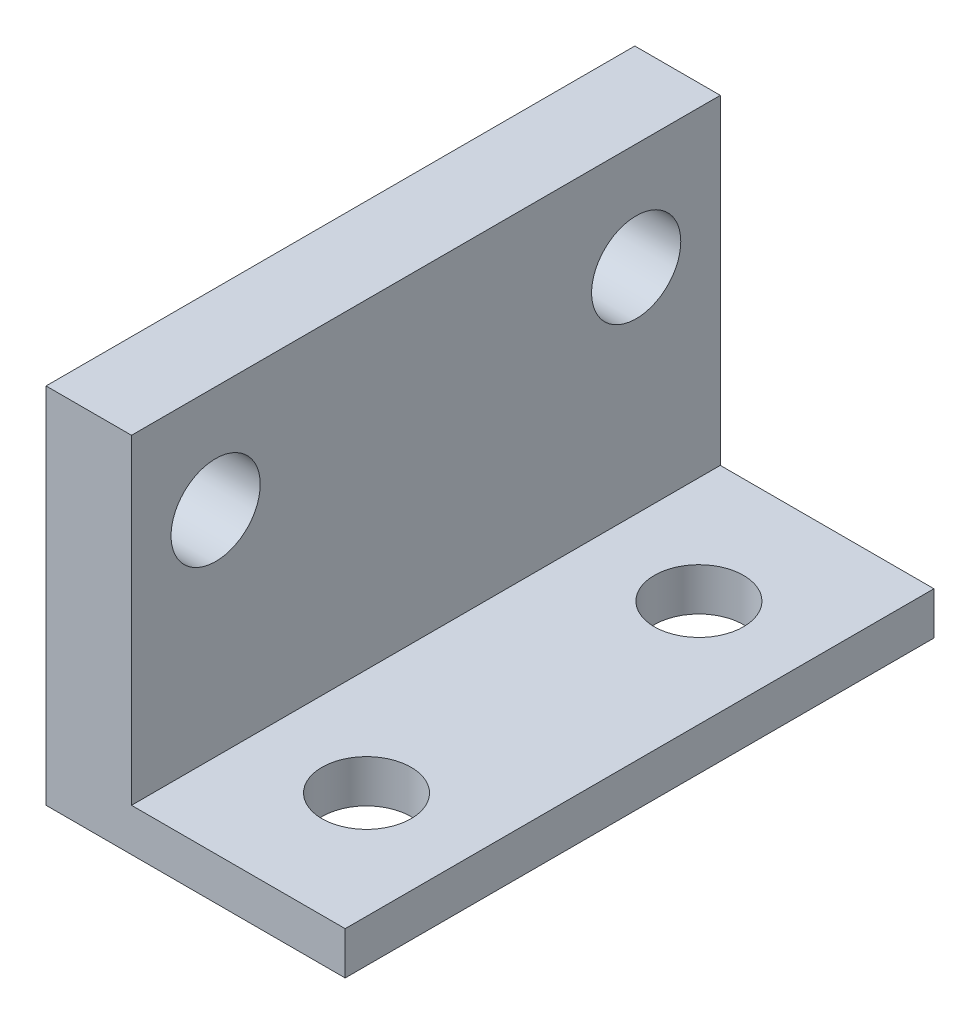
ISO-10303-21;
HEADER;
FILE_DESCRIPTION(('STEP AP214'),'2;1');
FILE_NAME('part.step','',(''),(''),'','','');
FILE_SCHEMA(('AUTOMOTIVE_DESIGN { 1 0 10303 214 1 1 1 1 }'));
ENDSEC;
DATA;
#1=APPLICATION_CONTEXT('core data for automotive mechanical design processes');
#2=APPLICATION_PROTOCOL_DEFINITION('international standard','automotive_design',2000,#1);
#3=PRODUCT_CONTEXT('',#1,'mechanical');
#4=PRODUCT('Part','Part','',(#3));
#5=PRODUCT_RELATED_PRODUCT_CATEGORY('part','',(#4));
#6=PRODUCT_DEFINITION_FORMATION('','',#4);
#7=PRODUCT_DEFINITION_CONTEXT('part definition',#1,'design');
#8=PRODUCT_DEFINITION('design','',#6,#7);
#9=PRODUCT_DEFINITION_SHAPE('','',#8);
#10=(LENGTH_UNIT() NAMED_UNIT(*) SI_UNIT(.MILLI.,.METRE.));
#11=(NAMED_UNIT(*) PLANE_ANGLE_UNIT() SI_UNIT($,.RADIAN.));
#12=(NAMED_UNIT(*) SI_UNIT($,.STERADIAN.) SOLID_ANGLE_UNIT());
#13=UNCERTAINTY_MEASURE_WITH_UNIT(LENGTH_MEASURE(1.E-05),#10,'distance_accuracy_value','');
#14=(GEOMETRIC_REPRESENTATION_CONTEXT(3) GLOBAL_UNCERTAINTY_ASSIGNED_CONTEXT((#13)) GLOBAL_UNIT_ASSIGNED_CONTEXT((#10,
#11,#12)) REPRESENTATION_CONTEXT('',''));
#15=CARTESIAN_POINT('',(0.,0.,0.));
#16=DIRECTION('',(0.,0.,1.));
#17=DIRECTION('',(1.,0.,0.));
#18=AXIS2_PLACEMENT_3D('',#15,#16,#17);
#19=CARTESIAN_POINT('',(0.,0.,35.));
#20=DIRECTION('',(0.,0.,1.));
#21=DIRECTION('',(1.,0.,0.));
#22=AXIS2_PLACEMENT_3D('',#19,#20,#21);
#23=PLANE('',#22);
#24=DIRECTION('',(1.,0.,0.));
#25=VECTOR('',#24,1.);
#26=CARTESIAN_POINT('',(0.,21.59,35.));
#27=LINE('',#26,#25);
#28=CARTESIAN_POINT('',(0.,21.59,35.));
#29=VERTEX_POINT('',#28);
#30=CARTESIAN_POINT('',(5.08,21.59,35.));
#31=VERTEX_POINT('',#30);
#32=EDGE_CURVE('E95',#29,#31,#27,.T.);
#33=ORIENTED_EDGE('',*,*,#32,.F.);
#34=DIRECTION('',(0.,1.,0.));
#35=VECTOR('',#34,1.);
#36=CARTESIAN_POINT('',(0.,2.54,35.));
#37=LINE('',#36,#35);
#38=CARTESIAN_POINT('',(0.,0.,35.));
#39=VERTEX_POINT('',#38);
#40=EDGE_CURVE('E140',#39,#29,#37,.T.);
#41=ORIENTED_EDGE('',*,*,#40,.F.);
#42=DIRECTION('',(1.,0.,0.));
#43=VECTOR('',#42,1.);
#44=CARTESIAN_POINT('',(0.,0.,35.));
#45=LINE('',#44,#43);
#46=CARTESIAN_POINT('',(17.78,0.,35.));
#47=VERTEX_POINT('',#46);
#48=EDGE_CURVE('E99',#39,#47,#45,.T.);
#49=ORIENTED_EDGE('',*,*,#48,.T.);
#50=DIRECTION('',(0.,1.,0.));
#51=VECTOR('',#50,1.);
#52=CARTESIAN_POINT('',(17.78,0.,35.));
#53=LINE('',#52,#51);
#54=CARTESIAN_POINT('',(17.78,2.54,35.));
#55=VERTEX_POINT('',#54);
#56=EDGE_CURVE('E109',#47,#55,#53,.T.);
#57=ORIENTED_EDGE('',*,*,#56,.T.);
#58=DIRECTION('',(1.,0.,0.));
#59=VECTOR('',#58,1.);
#60=CARTESIAN_POINT('',(0.,2.54,35.));
#61=LINE('',#60,#59);
#62=CARTESIAN_POINT('',(5.08,2.54,35.));
#63=VERTEX_POINT('',#62);
#64=EDGE_CURVE('E107',#63,#55,#61,.T.);
#65=ORIENTED_EDGE('',*,*,#64,.F.);
#66=DIRECTION('',(0.,1.,0.));
#67=VECTOR('',#66,1.);
#68=CARTESIAN_POINT('',(5.08,2.54,35.));
#69=LINE('',#68,#67);
#70=EDGE_CURVE('E137',#63,#31,#69,.T.);
#71=ORIENTED_EDGE('',*,*,#70,.T.);
#72=EDGE_LOOP('',(#33,#41,#49,#57,#65,#71));
#73=FACE_BOUND('',#72,.T.);
#74=ADVANCED_FACE('F33',(#73),#23,.T.);
#75=CARTESIAN_POINT('',(0.,21.59,35.));
#76=DIRECTION('',(0.,1.,0.));
#77=DIRECTION('',(0.,0.,1.));
#78=AXIS2_PLACEMENT_3D('',#75,#76,#77);
#79=PLANE('',#78);
#80=DIRECTION('',(1.,0.,0.));
#81=VECTOR('',#80,1.);
#82=CARTESIAN_POINT('',(0.,21.59,0.));
#83=LINE('',#82,#81);
#84=CARTESIAN_POINT('',(0.,21.59,0.));
#85=VERTEX_POINT('',#84);
#86=CARTESIAN_POINT('',(5.08,21.59,0.));
#87=VERTEX_POINT('',#86);
#88=EDGE_CURVE('E100',#85,#87,#83,.T.);
#89=ORIENTED_EDGE('',*,*,#88,.F.);
#90=DIRECTION('',(0.,0.,-1.));
#91=VECTOR('',#90,1.);
#92=CARTESIAN_POINT('',(0.,21.59,35.));
#93=LINE('',#92,#91);
#94=EDGE_CURVE('E11',#29,#85,#93,.T.);
#95=ORIENTED_EDGE('',*,*,#94,.F.);
#96=ORIENTED_EDGE('',*,*,#32,.T.);
#97=DIRECTION('',(0.,0.,-1.));
#98=VECTOR('',#97,1.);
#99=CARTESIAN_POINT('',(5.08,21.59,35.));
#100=LINE('',#99,#98);
#101=EDGE_CURVE('E142',#31,#87,#100,.T.);
#102=ORIENTED_EDGE('',*,*,#101,.T.);
#103=EDGE_LOOP('',(#89,#95,#96,#102));
#104=FACE_BOUND('',#103,.T.);
#105=ADVANCED_FACE('F148',(#104),#79,.T.);
#106=CARTESIAN_POINT('',(0.,0.,0.));
#107=DIRECTION('',(0.,0.,1.));
#108=DIRECTION('',(1.,0.,0.));
#109=AXIS2_PLACEMENT_3D('',#106,#107,#108);
#110=PLANE('',#109);
#111=ORIENTED_EDGE('',*,*,#88,.T.);
#112=DIRECTION('',(0.,1.,0.));
#113=VECTOR('',#112,1.);
#114=CARTESIAN_POINT('',(5.08,2.54,0.));
#115=LINE('',#114,#113);
#116=CARTESIAN_POINT('',(5.08,2.54,0.));
#117=VERTEX_POINT('',#116);
#118=EDGE_CURVE('E96',#117,#87,#115,.T.);
#119=ORIENTED_EDGE('',*,*,#118,.F.);
#120=DIRECTION('',(1.,0.,0.));
#121=VECTOR('',#120,1.);
#122=CARTESIAN_POINT('',(0.,2.54,0.));
#123=LINE('',#122,#121);
#124=CARTESIAN_POINT('',(17.78,2.54,0.));
#125=VERTEX_POINT('',#124);
#126=EDGE_CURVE('E111',#117,#125,#123,.T.);
#127=ORIENTED_EDGE('',*,*,#126,.T.);
#128=DIRECTION('',(0.,1.,0.));
#129=VECTOR('',#128,1.);
#130=CARTESIAN_POINT('',(17.78,0.,0.));
#131=LINE('',#130,#129);
#132=CARTESIAN_POINT('',(17.78,0.,0.));
#133=VERTEX_POINT('',#132);
#134=EDGE_CURVE('E106',#133,#125,#131,.T.);
#135=ORIENTED_EDGE('',*,*,#134,.F.);
#136=DIRECTION('',(1.,0.,0.));
#137=VECTOR('',#136,1.);
#138=CARTESIAN_POINT('',(0.,0.,0.));
#139=LINE('',#138,#137);
#140=CARTESIAN_POINT('',(0.,0.,0.));
#141=VERTEX_POINT('',#140);
#142=EDGE_CURVE('E82',#141,#133,#139,.T.);
#143=ORIENTED_EDGE('',*,*,#142,.F.);
#144=DIRECTION('',(0.,1.,0.));
#145=VECTOR('',#144,1.);
#146=CARTESIAN_POINT('',(0.,2.54,0.));
#147=LINE('',#146,#145);
#148=EDGE_CURVE('E88',#141,#85,#147,.T.);
#149=ORIENTED_EDGE('',*,*,#148,.T.);
#150=EDGE_LOOP('',(#111,#119,#127,#135,#143,#149));
#151=FACE_BOUND('',#150,.T.);
#152=ADVANCED_FACE('F104',(#151),#110,.F.);
#153=CARTESIAN_POINT('',(5.08,2.54,35.));
#154=DIRECTION('',(-1.,0.,0.));
#155=DIRECTION('',(0.,0.,1.));
#156=AXIS2_PLACEMENT_3D('',#153,#154,#155);
#157=PLANE('',#156);
#158=CARTESIAN_POINT('',(5.08,15.24,30.));
#159=DIRECTION('',(1.,0.,0.));
#160=DIRECTION('',(0.,0.,-1.));
#161=AXIS2_PLACEMENT_3D('',#158,#159,#160);
#162=CIRCLE('',#161,2.65);
#163=CARTESIAN_POINT('',(5.08,15.24,27.35));
#164=VERTEX_POINT('',#163);
#165=EDGE_CURVE('E189',#164,#164,#162,.T.);
#166=ORIENTED_EDGE('',*,*,#165,.F.);
#167=EDGE_LOOP('',(#166));
#168=FACE_BOUND('',#167,.T.);
#169=CARTESIAN_POINT('',(5.08,15.24,5.));
#170=DIRECTION('',(1.,0.,0.));
#171=DIRECTION('',(0.,0.,-1.));
#172=AXIS2_PLACEMENT_3D('',#169,#170,#171);
#173=CIRCLE('',#172,2.65);
#174=CARTESIAN_POINT('',(5.08,15.24,2.35));
#175=VERTEX_POINT('',#174);
#176=EDGE_CURVE('E127',#175,#175,#173,.T.);
#177=ORIENTED_EDGE('',*,*,#176,.F.);
#178=EDGE_LOOP('',(#177));
#179=FACE_BOUND('',#178,.T.);
#180=ORIENTED_EDGE('',*,*,#118,.T.);
#181=ORIENTED_EDGE('',*,*,#101,.F.);
#182=ORIENTED_EDGE('',*,*,#70,.F.);
#183=DIRECTION('',(0.,0.,-1.));
#184=VECTOR('',#183,1.);
#185=CARTESIAN_POINT('',(5.08,2.54,35.));
#186=LINE('',#185,#184);
#187=EDGE_CURVE('E43',#63,#117,#186,.T.);
#188=ORIENTED_EDGE('',*,*,#187,.T.);
#189=EDGE_LOOP('',(#180,#181,#182,#188));
#190=FACE_BOUND('',#189,.T.);
#191=ADVANCED_FACE('F151',(#168,#179,#190),#157,.F.);
#192=CARTESIAN_POINT('',(0.,2.54,35.));
#193=DIRECTION('',(-1.,0.,0.));
#194=DIRECTION('',(0.,0.,1.));
#195=AXIS2_PLACEMENT_3D('',#192,#193,#194);
#196=PLANE('',#195);
#197=CARTESIAN_POINT('',(0.,15.24,30.));
#198=DIRECTION('',(1.,0.,0.));
#199=DIRECTION('',(0.,0.,-1.));
#200=AXIS2_PLACEMENT_3D('',#197,#198,#199);
#201=CIRCLE('',#200,2.65);
#202=CARTESIAN_POINT('',(0.,15.24,27.35));
#203=VERTEX_POINT('',#202);
#204=EDGE_CURVE('E132',#203,#203,#201,.T.);
#205=ORIENTED_EDGE('',*,*,#204,.T.);
#206=EDGE_LOOP('',(#205));
#207=FACE_BOUND('',#206,.T.);
#208=CARTESIAN_POINT('',(0.,15.24,5.));
#209=DIRECTION('',(1.,0.,0.));
#210=DIRECTION('',(0.,0.,-1.));
#211=AXIS2_PLACEMENT_3D('',#208,#209,#210);
#212=CIRCLE('',#211,2.65);
#213=CARTESIAN_POINT('',(0.,15.24,2.35));
#214=VERTEX_POINT('',#213);
#215=EDGE_CURVE('E124',#214,#214,#212,.T.);
#216=ORIENTED_EDGE('',*,*,#215,.T.);
#217=EDGE_LOOP('',(#216));
#218=FACE_BOUND('',#217,.T.);
#219=ORIENTED_EDGE('',*,*,#148,.F.);
#220=DIRECTION('',(0.,0.,-1.));
#221=VECTOR('',#220,1.);
#222=CARTESIAN_POINT('',(0.,0.,35.));
#223=LINE('',#222,#221);
#224=EDGE_CURVE('E91',#39,#141,#223,.T.);
#225=ORIENTED_EDGE('',*,*,#224,.F.);
#226=ORIENTED_EDGE('',*,*,#40,.T.);
#227=ORIENTED_EDGE('',*,*,#94,.T.);
#228=EDGE_LOOP('',(#219,#225,#226,#227));
#229=FACE_BOUND('',#228,.T.);
#230=ADVANCED_FACE('F89',(#207,#218,#229),#196,.T.);
#231=CARTESIAN_POINT('',(0.,0.,35.));
#232=DIRECTION('',(0.,1.,0.));
#233=DIRECTION('',(0.,0.,1.));
#234=AXIS2_PLACEMENT_3D('',#231,#232,#233);
#235=PLANE('',#234);
#236=CARTESIAN_POINT('',(11.43,0.,27.38));
#237=DIRECTION('',(0.,1.,0.));
#238=DIRECTION('',(0.,0.,1.));
#239=AXIS2_PLACEMENT_3D('',#236,#237,#238);
#240=CIRCLE('',#239,2.65);
#241=CARTESIAN_POINT('',(11.43,0.,30.03));
#242=VERTEX_POINT('',#241);
#243=EDGE_CURVE('E202',#242,#242,#240,.T.);
#244=ORIENTED_EDGE('',*,*,#243,.T.);
#245=EDGE_LOOP('',(#244));
#246=FACE_BOUND('',#245,.T.);
#247=CARTESIAN_POINT('',(11.43,0.,7.62));
#248=DIRECTION('',(0.,1.,0.));
#249=DIRECTION('',(0.,0.,1.));
#250=AXIS2_PLACEMENT_3D('',#247,#248,#249);
#251=CIRCLE('',#250,2.65);
#252=CARTESIAN_POINT('',(11.43,0.,10.27));
#253=VERTEX_POINT('',#252);
#254=EDGE_CURVE('E193',#253,#253,#251,.T.);
#255=ORIENTED_EDGE('',*,*,#254,.T.);
#256=EDGE_LOOP('',(#255));
#257=FACE_BOUND('',#256,.T.);
#258=ORIENTED_EDGE('',*,*,#142,.T.);
#259=DIRECTION('',(0.,0.,-1.));
#260=VECTOR('',#259,1.);
#261=CARTESIAN_POINT('',(17.78,0.,35.));
#262=LINE('',#261,#260);
#263=EDGE_CURVE('E101',#47,#133,#262,.T.);
#264=ORIENTED_EDGE('',*,*,#263,.F.);
#265=ORIENTED_EDGE('',*,*,#48,.F.);
#266=ORIENTED_EDGE('',*,*,#224,.T.);
#267=EDGE_LOOP('',(#258,#264,#265,#266));
#268=FACE_BOUND('',#267,.T.);
#269=ADVANCED_FACE('F98',(#246,#257,#268),#235,.F.);
#270=CARTESIAN_POINT('',(17.78,0.,35.));
#271=DIRECTION('',(-1.,0.,0.));
#272=DIRECTION('',(0.,0.,1.));
#273=AXIS2_PLACEMENT_3D('',#270,#271,#272);
#274=PLANE('',#273);
#275=ORIENTED_EDGE('',*,*,#134,.T.);
#276=DIRECTION('',(0.,0.,-1.));
#277=VECTOR('',#276,1.);
#278=CARTESIAN_POINT('',(17.78,2.54,35.));
#279=LINE('',#278,#277);
#280=EDGE_CURVE('E37',#55,#125,#279,.T.);
#281=ORIENTED_EDGE('',*,*,#280,.F.);
#282=ORIENTED_EDGE('',*,*,#56,.F.);
#283=ORIENTED_EDGE('',*,*,#263,.T.);
#284=EDGE_LOOP('',(#275,#281,#282,#283));
#285=FACE_BOUND('',#284,.T.);
#286=ADVANCED_FACE('F155',(#285),#274,.F.);
#287=CARTESIAN_POINT('',(0.,2.54,35.));
#288=DIRECTION('',(0.,1.,0.));
#289=DIRECTION('',(0.,0.,1.));
#290=AXIS2_PLACEMENT_3D('',#287,#288,#289);
#291=PLANE('',#290);
#292=CARTESIAN_POINT('',(11.43,2.54,27.38));
#293=DIRECTION('',(0.,1.,0.));
#294=DIRECTION('',(0.,0.,1.));
#295=AXIS2_PLACEMENT_3D('',#292,#293,#294);
#296=CIRCLE('',#295,2.64999999999999);
#297=CARTESIAN_POINT('',(11.43,2.54,30.03));
#298=VERTEX_POINT('',#297);
#299=EDGE_CURVE('E205',#298,#298,#296,.T.);
#300=ORIENTED_EDGE('',*,*,#299,.F.);
#301=EDGE_LOOP('',(#300));
#302=FACE_BOUND('',#301,.T.);
#303=CARTESIAN_POINT('',(11.43,2.54,7.62));
#304=DIRECTION('',(0.,1.,0.));
#305=DIRECTION('',(0.,0.,1.));
#306=AXIS2_PLACEMENT_3D('',#303,#304,#305);
#307=CIRCLE('',#306,2.64999999999999);
#308=CARTESIAN_POINT('',(11.43,2.54,10.27));
#309=VERTEX_POINT('',#308);
#310=EDGE_CURVE('E197',#309,#309,#307,.T.);
#311=ORIENTED_EDGE('',*,*,#310,.F.);
#312=EDGE_LOOP('',(#311));
#313=FACE_BOUND('',#312,.T.);
#314=ORIENTED_EDGE('',*,*,#187,.F.);
#315=ORIENTED_EDGE('',*,*,#64,.T.);
#316=ORIENTED_EDGE('',*,*,#280,.T.);
#317=ORIENTED_EDGE('',*,*,#126,.F.);
#318=EDGE_LOOP('',(#314,#315,#316,#317));
#319=FACE_BOUND('',#318,.T.);
#320=ADVANCED_FACE('F35',(#302,#313,#319),#291,.T.);
#321=CARTESIAN_POINT('',(5.08,15.24,5.));
#322=DIRECTION('',(1.,0.,0.));
#323=DIRECTION('',(0.,0.,-1.));
#324=AXIS2_PLACEMENT_3D('',#321,#322,#323);
#325=CYLINDRICAL_SURFACE('',#324,2.65);
#326=ORIENTED_EDGE('',*,*,#215,.F.);
#327=EDGE_LOOP('',(#326));
#328=FACE_BOUND('',#327,.T.);
#329=ORIENTED_EDGE('',*,*,#176,.T.);
#330=EDGE_LOOP('',(#329));
#331=FACE_BOUND('',#330,.T.);
#332=ADVANCED_FACE('F154',(#328,#331),#325,.F.);
#333=CARTESIAN_POINT('',(5.08,15.24,30.));
#334=DIRECTION('',(1.,0.,0.));
#335=DIRECTION('',(0.,0.,-1.));
#336=AXIS2_PLACEMENT_3D('',#333,#334,#335);
#337=CYLINDRICAL_SURFACE('',#336,2.65);
#338=ORIENTED_EDGE('',*,*,#204,.F.);
#339=EDGE_LOOP('',(#338));
#340=FACE_BOUND('',#339,.T.);
#341=ORIENTED_EDGE('',*,*,#165,.T.);
#342=EDGE_LOOP('',(#341));
#343=FACE_BOUND('',#342,.T.);
#344=ADVANCED_FACE('F161',(#340,#343),#337,.F.);
#345=CARTESIAN_POINT('',(11.43,2.54,7.62));
#346=DIRECTION('',(0.,1.,0.));
#347=DIRECTION('',(0.,0.,1.));
#348=AXIS2_PLACEMENT_3D('',#345,#346,#347);
#349=CYLINDRICAL_SURFACE('',#348,2.64999999999999);
#350=ORIENTED_EDGE('',*,*,#254,.F.);
#351=EDGE_LOOP('',(#350));
#352=FACE_BOUND('',#351,.T.);
#353=ORIENTED_EDGE('',*,*,#310,.T.);
#354=EDGE_LOOP('',(#353));
#355=FACE_BOUND('',#354,.T.);
#356=ADVANCED_FACE('F210',(#352,#355),#349,.F.);
#357=CARTESIAN_POINT('',(11.43,2.54,27.38));
#358=DIRECTION('',(0.,1.,0.));
#359=DIRECTION('',(0.,0.,1.));
#360=AXIS2_PLACEMENT_3D('',#357,#358,#359);
#361=CYLINDRICAL_SURFACE('',#360,2.64999999999999);
#362=ORIENTED_EDGE('',*,*,#243,.F.);
#363=EDGE_LOOP('',(#362));
#364=FACE_BOUND('',#363,.T.);
#365=ORIENTED_EDGE('',*,*,#299,.T.);
#366=EDGE_LOOP('',(#365));
#367=FACE_BOUND('',#366,.T.);
#368=ADVANCED_FACE('F208',(#364,#367),#361,.F.);
#369=CLOSED_SHELL('',(#74,#105,#152,#191,#230,#269,#286,#320,#332,#344,#356,#368));
#370=MANIFOLD_SOLID_BREP('B2',#369);
#371=ADVANCED_BREP_SHAPE_REPRESENTATION('',(#18,#370),#14);
#372=SHAPE_DEFINITION_REPRESENTATION(#9,#371);
ENDSEC;
END-ISO-10303-21;
